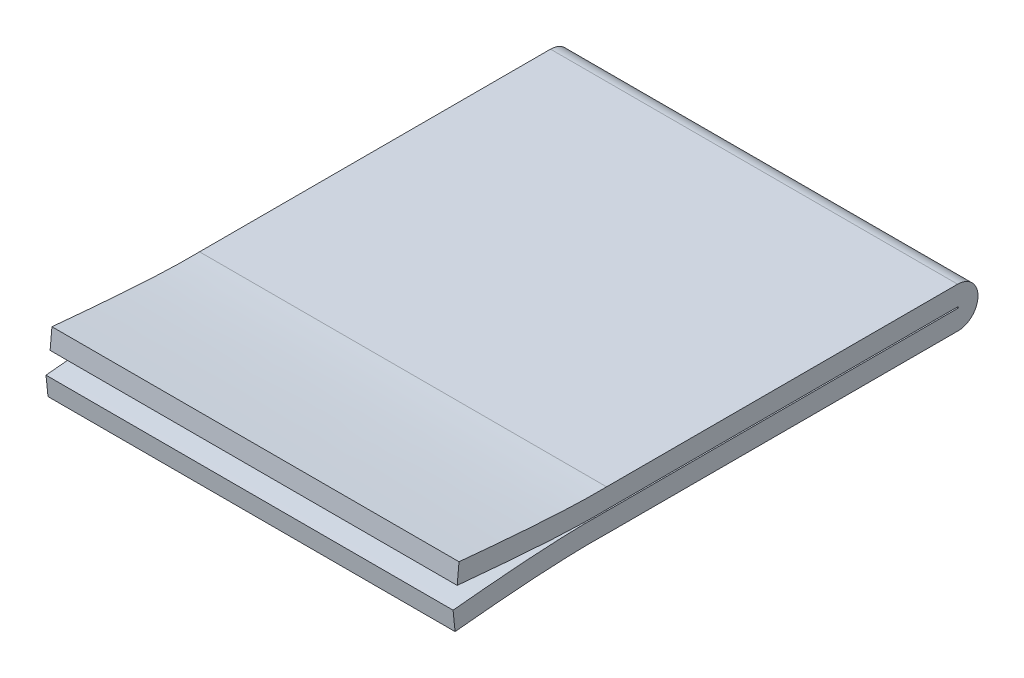
ISO-10303-21;
HEADER;
FILE_DESCRIPTION(('STEP AP214'),'2;1');
FILE_NAME('part.step','',(''),(''),'','','');
FILE_SCHEMA(('AUTOMOTIVE_DESIGN { 1 0 10303 214 1 1 1 1 }'));
ENDSEC;
DATA;
#1=APPLICATION_CONTEXT('core data for automotive mechanical design processes');
#2=APPLICATION_PROTOCOL_DEFINITION('international standard','automotive_design',2000,#1);
#3=PRODUCT_CONTEXT('',#1,'mechanical');
#4=PRODUCT('Part','Part','',(#3));
#5=PRODUCT_RELATED_PRODUCT_CATEGORY('part','',(#4));
#6=PRODUCT_DEFINITION_FORMATION('','',#4);
#7=PRODUCT_DEFINITION_CONTEXT('part definition',#1,'design');
#8=PRODUCT_DEFINITION('design','',#6,#7);
#9=PRODUCT_DEFINITION_SHAPE('','',#8);
#10=(LENGTH_UNIT() NAMED_UNIT(*) SI_UNIT(.MILLI.,.METRE.));
#11=(NAMED_UNIT(*) PLANE_ANGLE_UNIT() SI_UNIT($,.RADIAN.));
#12=(NAMED_UNIT(*) SI_UNIT($,.STERADIAN.) SOLID_ANGLE_UNIT());
#13=UNCERTAINTY_MEASURE_WITH_UNIT(LENGTH_MEASURE(1.E-05),#10,'distance_accuracy_value','');
#14=(GEOMETRIC_REPRESENTATION_CONTEXT(3) GLOBAL_UNCERTAINTY_ASSIGNED_CONTEXT((#13)) GLOBAL_UNIT_ASSIGNED_CONTEXT((#10,
#11,#12)) REPRESENTATION_CONTEXT('',''));
#15=CARTESIAN_POINT('',(0.,0.,0.));
#16=DIRECTION('',(0.,0.,1.));
#17=DIRECTION('',(1.,0.,0.));
#18=AXIS2_PLACEMENT_3D('',#15,#16,#17);
#19=CARTESIAN_POINT('',(435.000000000003,652.846287482866,76.8070420009833));
#20=CARTESIAN_POINT('',(435.000000000003,653.122264953827,74.0921844745389));
#21=CARTESIAN_POINT('',(435.000000000003,653.591532994853,69.2106673217189));
#22=CARTESIAN_POINT('',(435.000000000003,653.504018004788,65.6199093122771));
#23=B_SPLINE_CURVE_WITH_KNOTS('',3,(#19,#20,#21,#22),.UNSPECIFIED.,.F.,.F.,(4,4),(0.,1.),.UNSPECIFIED.);
#24=DIRECTION('',(-1.,0.,0.));
#25=VECTOR('',#24,1.);
#26=SURFACE_OF_LINEAR_EXTRUSION('',#23,#25);
#27=CARTESIAN_POINT('',(405.000000000003,652.846287482866,76.8070420009833));
#28=CARTESIAN_POINT('',(405.000000000003,653.122264953827,74.0921844745389));
#29=CARTESIAN_POINT('',(405.000000000003,653.591532994853,69.2106673217189));
#30=CARTESIAN_POINT('',(405.000000000003,653.504018004788,65.6199093122771));
#31=B_SPLINE_CURVE_WITH_KNOTS('',3,(#27,#28,#29,#30),.UNSPECIFIED.,.F.,.F.,(4,4),(0.,1.),.UNSPECIFIED.);
#32=CARTESIAN_POINT('',(405.000000000003,652.846287482866,76.8070420009833));
#33=VERTEX_POINT('',#32);
#34=CARTESIAN_POINT('',(405.000000000003,653.504018004788,65.6199093122771));
#35=VERTEX_POINT('',#34);
#36=EDGE_CURVE('E245',#33,#35,#31,.T.);
#37=ORIENTED_EDGE('',*,*,#36,.T.);
#38=DIRECTION('',(-1.,0.,0.));
#39=VECTOR('',#38,1.);
#40=CARTESIAN_POINT('',(435.000000000003,653.504018004788,65.6199093122771));
#41=LINE('',#40,#39);
#42=CARTESIAN_POINT('',(435.000000000003,653.504018004788,65.6199093122771));
#43=VERTEX_POINT('',#42);
#44=EDGE_CURVE('E11',#43,#35,#41,.T.);
#45=ORIENTED_EDGE('',*,*,#44,.F.);
#46=CARTESIAN_POINT('',(435.000000000003,652.846287482866,76.8070420009833));
#47=VERTEX_POINT('',#46);
#48=EDGE_CURVE('E273',#47,#43,#23,.T.);
#49=ORIENTED_EDGE('',*,*,#48,.F.);
#50=DIRECTION('',(-1.,0.,0.));
#51=VECTOR('',#50,1.);
#52=CARTESIAN_POINT('',(435.000000000003,652.846287482866,76.8070420009833));
#53=LINE('',#52,#51);
#54=EDGE_CURVE('E154',#47,#33,#53,.T.);
#55=ORIENTED_EDGE('',*,*,#54,.T.);
#56=EDGE_LOOP('',(#37,#45,#49,#55));
#57=FACE_BOUND('',#56,.T.);
#58=ADVANCED_FACE('F37',(#57),#26,.F.);
#59=CARTESIAN_POINT('',(435.000000000003,653.504018004788,39.6178957676005));
#60=DIRECTION('',(0.,1.,0.));
#61=DIRECTION('',(-1.,0.,0.));
#62=AXIS2_PLACEMENT_3D('',#59,#60,#61);
#63=PLANE('',#62);
#64=DIRECTION('',(0.,0.,-1.));
#65=VECTOR('',#64,1.);
#66=CARTESIAN_POINT('',(405.000000000003,653.504018004788,39.6178957676005));
#67=LINE('',#66,#65);
#68=CARTESIAN_POINT('',(405.000000000003,653.504018004788,39.6178957676005));
#69=VERTEX_POINT('',#68);
#70=EDGE_CURVE('E239',#35,#69,#67,.T.);
#71=ORIENTED_EDGE('',*,*,#70,.T.);
#72=DIRECTION('',(-1.,0.,0.));
#73=VECTOR('',#72,1.);
#74=CARTESIAN_POINT('',(435.000000000003,653.504018004788,39.6178957676005));
#75=LINE('',#74,#73);
#76=CARTESIAN_POINT('',(435.000000000003,653.504018004788,39.6178957676005));
#77=VERTEX_POINT('',#76);
#78=EDGE_CURVE('E46',#77,#69,#75,.T.);
#79=ORIENTED_EDGE('',*,*,#78,.F.);
#80=DIRECTION('',(0.,0.,-1.));
#81=VECTOR('',#80,1.);
#82=CARTESIAN_POINT('',(435.000000000003,653.504018004788,39.6178957676005));
#83=LINE('',#82,#81);
#84=EDGE_CURVE('E109',#43,#77,#83,.T.);
#85=ORIENTED_EDGE('',*,*,#84,.F.);
#86=ORIENTED_EDGE('',*,*,#44,.T.);
#87=EDGE_LOOP('',(#71,#79,#85,#86));
#88=FACE_BOUND('',#87,.T.);
#89=ADVANCED_FACE('F309',(#88),#63,.F.);
#90=CARTESIAN_POINT('',(435.000000000003,655.,39.7731633712));
#91=DIRECTION('',(-1.,0.,0.));
#92=DIRECTION('',(0.,-1.,0.));
#93=AXIS2_PLACEMENT_3D('',#90,#91,#92);
#94=CYLINDRICAL_SURFACE('',#93,1.50401800478792);
#95=CARTESIAN_POINT('',(405.000000000003,655.,39.7731633712));
#96=DIRECTION('',(1.,0.,0.));
#97=DIRECTION('',(0.,1.,0.));
#98=AXIS2_PLACEMENT_3D('',#95,#96,#97);
#99=CIRCLE('',#98,1.50401800478792);
#100=CARTESIAN_POINT('',(405.000000000003,656.504018004788,39.7731633712));
#101=VERTEX_POINT('',#100);
#102=EDGE_CURVE('E233',#69,#101,#99,.T.);
#103=ORIENTED_EDGE('',*,*,#102,.T.);
#104=DIRECTION('',(-1.,0.,0.));
#105=VECTOR('',#104,1.);
#106=CARTESIAN_POINT('',(435.000000000003,656.504018004788,39.7731633712));
#107=LINE('',#106,#105);
#108=CARTESIAN_POINT('',(435.000000000003,656.504018004788,39.7731633712));
#109=VERTEX_POINT('',#108);
#110=EDGE_CURVE('E225',#109,#101,#107,.T.);
#111=ORIENTED_EDGE('',*,*,#110,.F.);
#112=CARTESIAN_POINT('',(435.000000000003,655.,39.7731633712));
#113=DIRECTION('',(1.,0.,0.));
#114=DIRECTION('',(0.,1.,0.));
#115=AXIS2_PLACEMENT_3D('',#112,#113,#114);
#116=CIRCLE('',#115,1.50401800478792);
#117=EDGE_CURVE('E234',#77,#109,#116,.T.);
#118=ORIENTED_EDGE('',*,*,#117,.F.);
#119=ORIENTED_EDGE('',*,*,#78,.T.);
#120=EDGE_LOOP('',(#103,#111,#118,#119));
#121=FACE_BOUND('',#120,.T.);
#122=ADVANCED_FACE('F231',(#121),#94,.T.);
#123=CARTESIAN_POINT('',(435.000000000003,656.504018004788,39.7731633712));
#124=DIRECTION('',(0.,-1.,0.));
#125=DIRECTION('',(1.,0.,0.));
#126=AXIS2_PLACEMENT_3D('',#123,#124,#125);
#127=PLANE('',#126);
#128=DIRECTION('',(0.,0.,1.));
#129=VECTOR('',#128,1.);
#130=CARTESIAN_POINT('',(405.000000000003,656.504018004788,39.7731633712));
#131=LINE('',#130,#129);
#132=CARTESIAN_POINT('',(405.000000000003,656.504018004788,65.6409870641306));
#133=VERTEX_POINT('',#132);
#134=EDGE_CURVE('E241',#101,#133,#131,.T.);
#135=ORIENTED_EDGE('',*,*,#134,.T.);
#136=DIRECTION('',(-1.,0.,0.));
#137=VECTOR('',#136,1.);
#138=CARTESIAN_POINT('',(435.000000000003,656.504018004788,65.6409870641306));
#139=LINE('',#138,#137);
#140=CARTESIAN_POINT('',(435.000000000003,656.504018004788,65.6409870641306));
#141=VERTEX_POINT('',#140);
#142=EDGE_CURVE('E222',#141,#133,#139,.T.);
#143=ORIENTED_EDGE('',*,*,#142,.F.);
#144=DIRECTION('',(0.,0.,1.));
#145=VECTOR('',#144,1.);
#146=CARTESIAN_POINT('',(435.000000000003,656.504018004788,39.7731633712));
#147=LINE('',#146,#145);
#148=EDGE_CURVE('E292',#109,#141,#147,.T.);
#149=ORIENTED_EDGE('',*,*,#148,.F.);
#150=ORIENTED_EDGE('',*,*,#110,.T.);
#151=EDGE_LOOP('',(#135,#143,#149,#150));
#152=FACE_BOUND('',#151,.T.);
#153=ADVANCED_FACE('F303',(#152),#127,.F.);
#154=CARTESIAN_POINT('',(435.000000000003,656.504018004788,65.6409870641306));
#155=CARTESIAN_POINT('',(435.000000000003,656.434664349654,68.6934077180642));
#156=CARTESIAN_POINT('',(435.000000000003,656.908961344954,73.8062820006226));
#157=CARTESIAN_POINT('',(435.000000000003,657.16129247408,76.5160120879176));
#158=B_SPLINE_CURVE_WITH_KNOTS('',3,(#154,#155,#156,#157),.UNSPECIFIED.,.F.,.F.,(4,4),(0.,1.),.UNSPECIFIED.);
#159=DIRECTION('',(-1.,0.,0.));
#160=VECTOR('',#159,1.);
#161=SURFACE_OF_LINEAR_EXTRUSION('',#158,#160);
#162=CARTESIAN_POINT('',(405.000000000003,656.504018004788,65.6409870641306));
#163=CARTESIAN_POINT('',(405.000000000003,656.434664349654,68.6934077180642));
#164=CARTESIAN_POINT('',(405.000000000003,656.908961344954,73.8062820006226));
#165=CARTESIAN_POINT('',(405.000000000003,657.16129247408,76.5160120879176));
#166=B_SPLINE_CURVE_WITH_KNOTS('',3,(#162,#163,#164,#165),.UNSPECIFIED.,.F.,.F.,(4,4),(0.,1.),.UNSPECIFIED.);
#167=CARTESIAN_POINT('',(405.000000000003,657.16129247408,76.5160120879176));
#168=VERTEX_POINT('',#167);
#169=EDGE_CURVE('E243',#133,#168,#166,.T.);
#170=ORIENTED_EDGE('',*,*,#169,.T.);
#171=DIRECTION('',(-1.,0.,0.));
#172=VECTOR('',#171,1.);
#173=CARTESIAN_POINT('',(435.000000000003,657.16129247408,76.5160120879176));
#174=LINE('',#173,#172);
#175=CARTESIAN_POINT('',(435.000000000003,657.16129247408,76.5160120879176));
#176=VERTEX_POINT('',#175);
#177=EDGE_CURVE('E219',#176,#168,#174,.T.);
#178=ORIENTED_EDGE('',*,*,#177,.F.);
#179=EDGE_CURVE('E293',#141,#176,#158,.T.);
#180=ORIENTED_EDGE('',*,*,#179,.F.);
#181=ORIENTED_EDGE('',*,*,#142,.T.);
#182=EDGE_LOOP('',(#170,#178,#180,#181));
#183=FACE_BOUND('',#182,.T.);
#184=ADVANCED_FACE('F300',(#183),#161,.F.);
#185=CARTESIAN_POINT('',(435.000000000003,657.16129247408,76.5160120879176));
#186=DIRECTION('',(0.,-0.0927192569325701,-0.995692291520765));
#187=DIRECTION('',(0.,0.995692291520765,-0.0927192569325702));
#188=AXIS2_PLACEMENT_3D('',#185,#186,#187);
#189=PLANE('',#188);
#190=DIRECTION('',(0.,-0.995692291520765,0.0927192569325701));
#191=VECTOR('',#190,1.);
#192=CARTESIAN_POINT('',(405.000000000003,657.16129247408,76.5160120879176));
#193=LINE('',#192,#191);
#194=CARTESIAN_POINT('',(405.000000000003,655.717538651375,76.6504550104699));
#195=VERTEX_POINT('',#194);
#196=EDGE_CURVE('E251',#168,#195,#193,.T.);
#197=ORIENTED_EDGE('',*,*,#196,.T.);
#198=DIRECTION('',(-1.,0.,0.));
#199=VECTOR('',#198,1.);
#200=CARTESIAN_POINT('',(435.000000000003,655.717538651375,76.6504550104699));
#201=LINE('',#200,#199);
#202=CARTESIAN_POINT('',(435.000000000003,655.717538651375,76.6504550104699));
#203=VERTEX_POINT('',#202);
#204=EDGE_CURVE('E216',#203,#195,#201,.T.);
#205=ORIENTED_EDGE('',*,*,#204,.F.);
#206=DIRECTION('',(0.,-0.995692291520765,0.0927192569325701));
#207=VECTOR('',#206,1.);
#208=CARTESIAN_POINT('',(435.000000000003,657.16129247408,76.5160120879176));
#209=LINE('',#208,#207);
#210=EDGE_CURVE('E194',#176,#203,#209,.T.);
#211=ORIENTED_EDGE('',*,*,#210,.F.);
#212=ORIENTED_EDGE('',*,*,#177,.T.);
#213=EDGE_LOOP('',(#197,#205,#211,#212));
#214=FACE_BOUND('',#213,.T.);
#215=ADVANCED_FACE('F184',(#214),#189,.F.);
#216=CARTESIAN_POINT('',(435.000000000003,655.717538651375,76.6504550104699));
#217=CARTESIAN_POINT('',(435.000000000003,655.700934265508,76.4721440580295));
#218=CARTESIAN_POINT('',(435.000000000003,655.668912909642,76.1281225821978));
#219=CARTESIAN_POINT('',(435.000000000003,655.596214835522,75.3391976917732));
#220=CARTESIAN_POINT('',(435.000000000003,655.498830785754,74.2544502846017));
#221=CARTESIAN_POINT('',(435.000000000003,655.37839433874,72.8242569968437));
#222=CARTESIAN_POINT('',(435.000000000003,655.263919448274,71.3233075664775));
#223=CARTESIAN_POINT('',(435.000000000003,655.164199353869,69.8012259891182));
#224=CARTESIAN_POINT('',(435.000000000003,655.088306375869,68.3073447666845));
#225=CARTESIAN_POINT('',(435.000000000003,655.052445364851,67.1297358740434));
#226=CARTESIAN_POINT('',(435.000000000003,655.045235613158,66.2423643065345));
#227=CARTESIAN_POINT('',(435.000000000003,655.049413704997,65.8334911249161));
#228=CARTESIAN_POINT('',(435.000000000003,655.054018004788,65.6247604664361));
#229=B_SPLINE_CURVE_WITH_KNOTS('',3,(#216,#217,#218,#219,#220,#221,#222,#223,#224,#225,#226,
#227,#228),.UNSPECIFIED.,.F.,.F.,(4,1,1,1,1,1,1,1,1,1,4),(0.00171801654150134,
0.0641106405076575,0.126503264473814,0.251288512406126,0.376073760338438,0.500859008270751,
0.625644256203063,0.750429504135375,0.875214752067688,0.937607376033844,1.),.UNSPECIFIED.);
#230=DIRECTION('',(-1.,0.,0.));
#231=VECTOR('',#230,1.);
#232=SURFACE_OF_LINEAR_EXTRUSION('',#229,#231);
#233=CARTESIAN_POINT('',(405.000000000003,655.717538651375,76.6504550104699));
#234=CARTESIAN_POINT('',(405.000000000003,655.700934265508,76.4721440580295));
#235=CARTESIAN_POINT('',(405.000000000003,655.668912909642,76.1281225821978));
#236=CARTESIAN_POINT('',(405.000000000003,655.596214835522,75.3391976917732));
#237=CARTESIAN_POINT('',(405.000000000003,655.498830785754,74.2544502846017));
#238=CARTESIAN_POINT('',(405.000000000003,655.37839433874,72.8242569968437));
#239=CARTESIAN_POINT('',(405.000000000003,655.263919448274,71.3233075664775));
#240=CARTESIAN_POINT('',(405.000000000003,655.164199353869,69.8012259891182));
#241=CARTESIAN_POINT('',(405.000000000003,655.088306375869,68.3073447666845));
#242=CARTESIAN_POINT('',(405.000000000003,655.052445364851,67.1297358740434));
#243=CARTESIAN_POINT('',(405.000000000003,655.045235613158,66.2423643065345));
#244=CARTESIAN_POINT('',(405.000000000003,655.049413704997,65.8334911249161));
#245=CARTESIAN_POINT('',(405.000000000003,655.054018004788,65.6247604664361));
#246=B_SPLINE_CURVE_WITH_KNOTS('',3,(#233,#234,#235,#236,#237,#238,#239,#240,#241,#242,#243,
#244,#245),.UNSPECIFIED.,.F.,.F.,(4,1,1,1,1,1,1,1,1,1,4),(0.00171801654150134,
0.0641106405076575,0.126503264473814,0.251288512406126,0.376073760338438,0.500859008270751,
0.625644256203063,0.750429504135375,0.875214752067688,0.937607376033844,1.),.UNSPECIFIED.);
#247=CARTESIAN_POINT('',(405.000000000003,655.054018004788,65.6247604664361));
#248=VERTEX_POINT('',#247);
#249=EDGE_CURVE('E256',#195,#248,#246,.T.);
#250=ORIENTED_EDGE('',*,*,#249,.T.);
#251=DIRECTION('',(-1.,0.,0.));
#252=VECTOR('',#251,1.);
#253=CARTESIAN_POINT('',(435.000000000003,655.054018004788,65.6247604664361));
#254=LINE('',#253,#252);
#255=CARTESIAN_POINT('',(435.000000000003,655.054018004788,65.6247604664361));
#256=VERTEX_POINT('',#255);
#257=EDGE_CURVE('E209',#256,#248,#254,.T.);
#258=ORIENTED_EDGE('',*,*,#257,.F.);
#259=EDGE_CURVE('E187',#203,#256,#229,.T.);
#260=ORIENTED_EDGE('',*,*,#259,.F.);
#261=ORIENTED_EDGE('',*,*,#204,.T.);
#262=EDGE_LOOP('',(#250,#258,#260,#261));
#263=FACE_BOUND('',#262,.T.);
#264=ADVANCED_FACE('F179',(#263),#232,.F.);
#265=CARTESIAN_POINT('',(435.000000000003,655.054018004788,39.7731633712));
#266=DIRECTION('',(0.,1.,0.));
#267=DIRECTION('',(0.,0.,1.));
#268=AXIS2_PLACEMENT_3D('',#265,#266,#267);
#269=PLANE('',#268);
#270=DIRECTION('',(0.,0.,-1.));
#271=VECTOR('',#270,1.);
#272=CARTESIAN_POINT('',(405.000000000003,655.054018004788,39.7731633712));
#273=LINE('',#272,#271);
#274=CARTESIAN_POINT('',(405.000000000003,655.054018004788,39.7731633712));
#275=VERTEX_POINT('',#274);
#276=EDGE_CURVE('E207',#248,#275,#273,.T.);
#277=ORIENTED_EDGE('',*,*,#276,.T.);
#278=DIRECTION('',(-1.,0.,0.));
#279=VECTOR('',#278,1.);
#280=CARTESIAN_POINT('',(435.000000000003,655.054018004788,39.7731633712));
#281=LINE('',#280,#279);
#282=CARTESIAN_POINT('',(435.000000000003,655.054018004788,39.7731633712));
#283=VERTEX_POINT('',#282);
#284=EDGE_CURVE('E205',#283,#275,#281,.T.);
#285=ORIENTED_EDGE('',*,*,#284,.F.);
#286=DIRECTION('',(0.,0.,-1.));
#287=VECTOR('',#286,1.);
#288=CARTESIAN_POINT('',(435.000000000003,655.054018004788,39.7731633712));
#289=LINE('',#288,#287);
#290=EDGE_CURVE('E193',#256,#283,#289,.T.);
#291=ORIENTED_EDGE('',*,*,#290,.F.);
#292=ORIENTED_EDGE('',*,*,#257,.T.);
#293=EDGE_LOOP('',(#277,#285,#291,#292));
#294=FACE_BOUND('',#293,.T.);
#295=ADVANCED_FACE('F175',(#294),#269,.F.);
#296=CARTESIAN_POINT('',(435.000000000003,655.,39.7731633712));
#297=DIRECTION('',(-1.,0.,0.));
#298=DIRECTION('',(0.,-1.,0.));
#299=AXIS2_PLACEMENT_3D('',#296,#297,#298);
#300=CYLINDRICAL_SURFACE('',#299,0.0540180047879017);
#301=CARTESIAN_POINT('',(405.000000000003,655.,39.7731633712));
#302=DIRECTION('',(-1.,0.,0.));
#303=DIRECTION('',(0.,1.,0.));
#304=AXIS2_PLACEMENT_3D('',#301,#302,#303);
#305=CIRCLE('',#304,0.0540180047879017);
#306=CARTESIAN_POINT('',(405.000000000003,654.954018004788,39.7448155148866));
#307=VERTEX_POINT('',#306);
#308=EDGE_CURVE('E211',#275,#307,#305,.T.);
#309=ORIENTED_EDGE('',*,*,#308,.T.);
#310=DIRECTION('',(-1.,0.,0.));
#311=VECTOR('',#310,1.);
#312=CARTESIAN_POINT('',(435.000000000003,654.954018004788,39.7448155148866));
#313=LINE('',#312,#311);
#314=CARTESIAN_POINT('',(435.000000000003,654.954018004788,39.7448155148866));
#315=VERTEX_POINT('',#314);
#316=EDGE_CURVE('E149',#315,#307,#313,.T.);
#317=ORIENTED_EDGE('',*,*,#316,.F.);
#318=CARTESIAN_POINT('',(435.000000000003,655.,39.7731633712));
#319=DIRECTION('',(-1.,0.,0.));
#320=DIRECTION('',(0.,1.,0.));
#321=AXIS2_PLACEMENT_3D('',#318,#319,#320);
#322=CIRCLE('',#321,0.0540180047879017);
#323=EDGE_CURVE('E140',#283,#315,#322,.T.);
#324=ORIENTED_EDGE('',*,*,#323,.F.);
#325=ORIENTED_EDGE('',*,*,#284,.T.);
#326=EDGE_LOOP('',(#309,#317,#324,#325));
#327=FACE_BOUND('',#326,.T.);
#328=ADVANCED_FACE('F172',(#327),#300,.F.);
#329=CARTESIAN_POINT('',(435.000000000003,654.954018004788,39.7448155148865));
#330=DIRECTION('',(0.,-1.,0.));
#331=DIRECTION('',(0.,0.,-1.));
#332=AXIS2_PLACEMENT_3D('',#329,#330,#331);
#333=PLANE('',#332);
#334=DIRECTION('',(0.,0.,1.));
#335=VECTOR('',#334,1.);
#336=CARTESIAN_POINT('',(405.000000000003,654.954018004788,39.7448155148865));
#337=LINE('',#336,#335);
#338=CARTESIAN_POINT('',(405.000000000003,654.954018004788,65.6024321495346));
#339=VERTEX_POINT('',#338);
#340=EDGE_CURVE('E148',#307,#339,#337,.T.);
#341=ORIENTED_EDGE('',*,*,#340,.T.);
#342=DIRECTION('',(-1.,0.,0.));
#343=VECTOR('',#342,1.);
#344=CARTESIAN_POINT('',(435.000000000003,654.954018004788,65.6024321495346));
#345=LINE('',#344,#343);
#346=CARTESIAN_POINT('',(435.000000000003,654.954018004788,65.6024321495346));
#347=VERTEX_POINT('',#346);
#348=EDGE_CURVE('E145',#347,#339,#345,.T.);
#349=ORIENTED_EDGE('',*,*,#348,.F.);
#350=DIRECTION('',(0.,0.,1.));
#351=VECTOR('',#350,1.);
#352=CARTESIAN_POINT('',(435.000000000003,654.954018004788,39.7448155148865));
#353=LINE('',#352,#351);
#354=EDGE_CURVE('E134',#315,#347,#353,.T.);
#355=ORIENTED_EDGE('',*,*,#354,.F.);
#356=ORIENTED_EDGE('',*,*,#316,.T.);
#357=EDGE_LOOP('',(#341,#349,#355,#356));
#358=FACE_BOUND('',#357,.T.);
#359=ADVANCED_FACE('F146',(#358),#333,.F.);
#360=CARTESIAN_POINT('',(435.000000000003,654.954018004788,65.6024321495346));
#361=CARTESIAN_POINT('',(435.000000000003,654.965538805712,66.0854110000193));
#362=CARTESIAN_POINT('',(435.000000000003,654.969151827876,67.0337761688225));
#363=CARTESIAN_POINT('',(435.000000000003,654.93136107985,68.5642218446653));
#364=CARTESIAN_POINT('',(435.000000000003,654.858532994061,70.1145387010842));
#365=CARTESIAN_POINT('',(435.000000000003,654.760035206356,71.6608861372114));
#366=CARTESIAN_POINT('',(435.000000000003,654.644705075598,73.1603198504041));
#367=CARTESIAN_POINT('',(435.000000000003,654.52123735894,74.5758996058551));
#368=CARTESIAN_POINT('',(435.000000000003,654.419377817782,75.6474805841078));
#369=CARTESIAN_POINT('',(435.000000000003,654.341860789947,76.4301645639778));
#370=CARTESIAN_POINT('',(435.000000000003,654.30698221145,76.7753454442564));
#371=CARTESIAN_POINT('',(435.000000000003,654.288853164796,76.9536852869441));
#372=B_SPLINE_CURVE_WITH_KNOTS('',3,(#360,#361,#362,#363,#364,#365,#366,#367,#368,#369,#370,
#371),.UNSPECIFIED.,.F.,.F.,(4,1,1,1,1,1,1,1,1,4),(0.00158657657242012,0.126388254500868,
0.251189932429315,0.375991610357763,0.50079328828621,0.625594966214658,0.750396644143105,
0.875198322071552,0.937599161035776,1.),.UNSPECIFIED.);
#373=DIRECTION('',(-1.,0.,0.));
#374=VECTOR('',#373,1.);
#375=SURFACE_OF_LINEAR_EXTRUSION('',#372,#374);
#376=CARTESIAN_POINT('',(405.000000000003,654.954018004788,65.6024321495346));
#377=CARTESIAN_POINT('',(405.000000000003,654.965538805712,66.0854110000193));
#378=CARTESIAN_POINT('',(405.000000000003,654.969151827876,67.0337761688225));
#379=CARTESIAN_POINT('',(405.000000000003,654.93136107985,68.5642218446653));
#380=CARTESIAN_POINT('',(405.000000000003,654.858532994061,70.1145387010842));
#381=CARTESIAN_POINT('',(405.000000000003,654.760035206356,71.6608861372114));
#382=CARTESIAN_POINT('',(405.000000000003,654.644705075598,73.1603198504041));
#383=CARTESIAN_POINT('',(405.000000000003,654.52123735894,74.5758996058551));
#384=CARTESIAN_POINT('',(405.000000000003,654.419377817782,75.6474805841078));
#385=CARTESIAN_POINT('',(405.000000000003,654.341860789947,76.4301645639778));
#386=CARTESIAN_POINT('',(405.000000000003,654.30698221145,76.7753454442564));
#387=CARTESIAN_POINT('',(405.000000000003,654.288853164796,76.9536852869441));
#388=B_SPLINE_CURVE_WITH_KNOTS('',3,(#376,#377,#378,#379,#380,#381,#382,#383,#384,#385,#386,
#387),.UNSPECIFIED.,.F.,.F.,(4,1,1,1,1,1,1,1,1,4),(0.00158657657242012,0.126388254500868,
0.251189932429315,0.375991610357763,0.50079328828621,0.625594966214658,0.750396644143105,
0.875198322071552,0.937599161035776,1.),.UNSPECIFIED.);
#389=CARTESIAN_POINT('',(405.000000000003,654.288853164796,76.9536852869441));
#390=VERTEX_POINT('',#389);
#391=EDGE_CURVE('E95',#339,#390,#388,.T.);
#392=ORIENTED_EDGE('',*,*,#391,.T.);
#393=DIRECTION('',(-1.,0.,0.));
#394=VECTOR('',#393,1.);
#395=CARTESIAN_POINT('',(435.000000000003,654.288853164796,76.9536852869441));
#396=LINE('',#395,#394);
#397=CARTESIAN_POINT('',(435.000000000003,654.288853164796,76.9536852869441));
#398=VERTEX_POINT('',#397);
#399=EDGE_CURVE('E150',#398,#390,#396,.T.);
#400=ORIENTED_EDGE('',*,*,#399,.F.);
#401=EDGE_CURVE('E138',#347,#398,#372,.T.);
#402=ORIENTED_EDGE('',*,*,#401,.F.);
#403=ORIENTED_EDGE('',*,*,#348,.T.);
#404=EDGE_LOOP('',(#392,#400,#402,#403));
#405=FACE_BOUND('',#404,.T.);
#406=ADVANCED_FACE('F152',(#405),#375,.F.);
#407=CARTESIAN_POINT('',(435.000000000003,654.288853164796,76.9536852869441));
#408=DIRECTION('',(0.,0.101133300662667,-0.994872884089759));
#409=DIRECTION('',(0.,0.994872884089759,0.101133300662667));
#410=AXIS2_PLACEMENT_3D('',#407,#408,#409);
#411=PLANE('',#410);
#412=DIRECTION('',(0.,-0.994872884089759,-0.101133300662667));
#413=VECTOR('',#412,1.);
#414=CARTESIAN_POINT('',(405.000000000003,654.288853164796,76.9536852869441));
#415=LINE('',#414,#413);
#416=EDGE_CURVE('E101',#390,#33,#415,.T.);
#417=ORIENTED_EDGE('',*,*,#416,.T.);
#418=ORIENTED_EDGE('',*,*,#54,.F.);
#419=DIRECTION('',(0.,-0.994872884089759,-0.101133300662667));
#420=VECTOR('',#419,1.);
#421=CARTESIAN_POINT('',(435.000000000003,654.288853164796,76.9536852869441));
#422=LINE('',#421,#420);
#423=EDGE_CURVE('E54',#398,#47,#422,.T.);
#424=ORIENTED_EDGE('',*,*,#423,.F.);
#425=ORIENTED_EDGE('',*,*,#399,.T.);
#426=EDGE_LOOP('',(#417,#418,#424,#425));
#427=FACE_BOUND('',#426,.T.);
#428=ADVANCED_FACE('F168',(#427),#411,.F.);
#429=CARTESIAN_POINT('',(435.000000000003,653.311462416712,71.5419383377542));
#430=DIRECTION('',(-1.,0.,0.));
#431=DIRECTION('',(0.,0.,1.));
#432=AXIS2_PLACEMENT_3D('',#429,#430,#431);
#433=PLANE('',#432);
#434=ORIENTED_EDGE('',*,*,#48,.T.);
#435=ORIENTED_EDGE('',*,*,#84,.T.);
#436=ORIENTED_EDGE('',*,*,#117,.T.);
#437=ORIENTED_EDGE('',*,*,#148,.T.);
#438=ORIENTED_EDGE('',*,*,#179,.T.);
#439=ORIENTED_EDGE('',*,*,#210,.T.);
#440=ORIENTED_EDGE('',*,*,#259,.T.);
#441=ORIENTED_EDGE('',*,*,#290,.T.);
#442=ORIENTED_EDGE('',*,*,#323,.T.);
#443=ORIENTED_EDGE('',*,*,#354,.T.);
#444=ORIENTED_EDGE('',*,*,#401,.T.);
#445=ORIENTED_EDGE('',*,*,#423,.T.);
#446=EDGE_LOOP('',(#434,#435,#436,#437,#438,#439,#440,#441,#442,#443,#444,#445));
#447=FACE_BOUND('',#446,.T.);
#448=ADVANCED_FACE('F136',(#447),#433,.F.);
#449=CARTESIAN_POINT('',(405.000000000003,653.311462416712,71.5419383377542));
#450=DIRECTION('',(-1.,0.,0.));
#451=DIRECTION('',(0.,0.,1.));
#452=AXIS2_PLACEMENT_3D('',#449,#450,#451);
#453=PLANE('',#452);
#454=ORIENTED_EDGE('',*,*,#36,.F.);
#455=ORIENTED_EDGE('',*,*,#416,.F.);
#456=ORIENTED_EDGE('',*,*,#391,.F.);
#457=ORIENTED_EDGE('',*,*,#340,.F.);
#458=ORIENTED_EDGE('',*,*,#308,.F.);
#459=ORIENTED_EDGE('',*,*,#276,.F.);
#460=ORIENTED_EDGE('',*,*,#249,.F.);
#461=ORIENTED_EDGE('',*,*,#196,.F.);
#462=ORIENTED_EDGE('',*,*,#169,.F.);
#463=ORIENTED_EDGE('',*,*,#134,.F.);
#464=ORIENTED_EDGE('',*,*,#102,.F.);
#465=ORIENTED_EDGE('',*,*,#70,.F.);
#466=EDGE_LOOP('',(#454,#455,#456,#457,#458,#459,#460,#461,#462,#463,#464,#465));
#467=FACE_BOUND('',#466,.T.);
#468=ADVANCED_FACE('F238',(#467),#453,.T.);
#469=CLOSED_SHELL('',(#58,#89,#122,#153,#184,#215,#264,#295,#328,#359,#406,#428,#448,#468));
#470=MANIFOLD_SOLID_BREP('B2',#469);
#471=ADVANCED_BREP_SHAPE_REPRESENTATION('',(#18,#470),#14);
#472=SHAPE_DEFINITION_REPRESENTATION(#9,#471);
ENDSEC;
END-ISO-10303-21;
